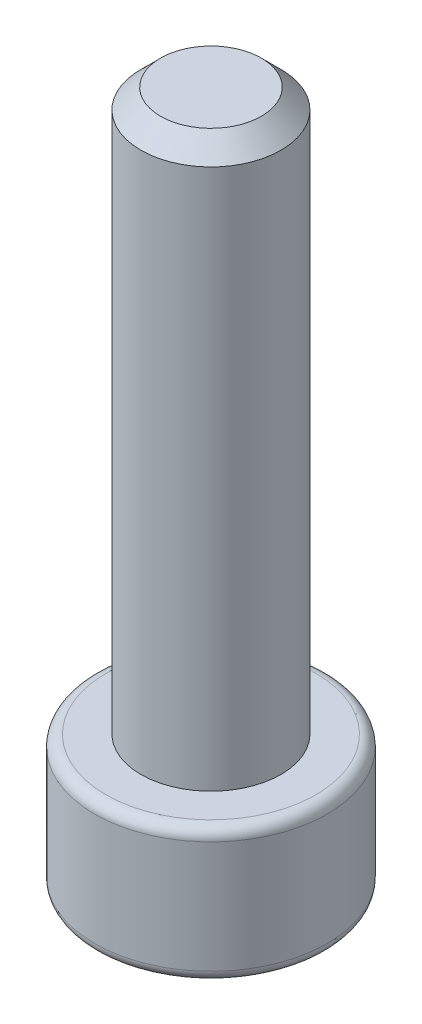
ISO-10303-21;
HEADER;
FILE_DESCRIPTION(('STEP AP214'),'2;1');
FILE_NAME('part.step','',(''),(''),'','','');
FILE_SCHEMA(('AUTOMOTIVE_DESIGN { 1 0 10303 214 1 1 1 1 }'));
ENDSEC;
DATA;
#1=APPLICATION_CONTEXT('core data for automotive mechanical design processes');
#2=APPLICATION_PROTOCOL_DEFINITION('international standard','automotive_design',2000,#1);
#3=PRODUCT_CONTEXT('',#1,'mechanical');
#4=PRODUCT('Part','Part','',(#3));
#5=PRODUCT_RELATED_PRODUCT_CATEGORY('part','',(#4));
#6=PRODUCT_DEFINITION_FORMATION('','',#4);
#7=PRODUCT_DEFINITION_CONTEXT('part definition',#1,'design');
#8=PRODUCT_DEFINITION('design','',#6,#7);
#9=PRODUCT_DEFINITION_SHAPE('','',#8);
#10=(LENGTH_UNIT() NAMED_UNIT(*) SI_UNIT(.MILLI.,.METRE.));
#11=(NAMED_UNIT(*) PLANE_ANGLE_UNIT() SI_UNIT($,.RADIAN.));
#12=(NAMED_UNIT(*) SI_UNIT($,.STERADIAN.) SOLID_ANGLE_UNIT());
#13=UNCERTAINTY_MEASURE_WITH_UNIT(LENGTH_MEASURE(1.E-05),#10,'distance_accuracy_value','');
#14=(GEOMETRIC_REPRESENTATION_CONTEXT(3) GLOBAL_UNCERTAINTY_ASSIGNED_CONTEXT((#13)) GLOBAL_UNIT_ASSIGNED_CONTEXT((#10,
#11,#12)) REPRESENTATION_CONTEXT('',''));
#15=CARTESIAN_POINT('',(0.,0.,0.));
#16=DIRECTION('',(0.,0.,1.));
#17=DIRECTION('',(1.,0.,0.));
#18=AXIS2_PLACEMENT_3D('',#15,#16,#17);
#19=CARTESIAN_POINT('',(0.,0.,0.));
#20=DIRECTION('',(0.,1.,0.));
#21=DIRECTION('',(0.,0.,1.));
#22=AXIS2_PLACEMENT_3D('',#19,#20,#21);
#23=PLANE('',#22);
#24=CARTESIAN_POINT('',(0.,0.,0.));
#25=DIRECTION('',(0.,1.,0.));
#26=DIRECTION('',(0.,0.,1.));
#27=AXIS2_PLACEMENT_3D('',#24,#25,#26);
#28=CIRCLE('',#27,3.75);
#29=CARTESIAN_POINT('',(0.,0.,3.75));
#30=VERTEX_POINT('',#29);
#31=EDGE_CURVE('E56',#30,#30,#28,.F.);
#32=ORIENTED_EDGE('',*,*,#31,.T.);
#33=EDGE_LOOP('',(#32));
#34=FACE_BOUND('',#33,.T.);
#35=DIRECTION('',(0.5,0.,0.866025403784439));
#36=VECTOR('',#35,1.);
#37=CARTESIAN_POINT('',(2.1650635094611,0.,-1.25));
#38=LINE('',#37,#36);
#39=CARTESIAN_POINT('',(1.44337567297406,0.,-2.5));
#40=VERTEX_POINT('',#39);
#41=CARTESIAN_POINT('',(2.88675134594813,0.,0.));
#42=VERTEX_POINT('',#41);
#43=EDGE_CURVE('E71',#40,#42,#38,.T.);
#44=ORIENTED_EDGE('',*,*,#43,.F.);
#45=DIRECTION('',(1.,0.,0.));
#46=VECTOR('',#45,1.);
#47=CARTESIAN_POINT('',(0.,0.,-2.5));
#48=LINE('',#47,#46);
#49=CARTESIAN_POINT('',(-1.44337567297406,0.,-2.5));
#50=VERTEX_POINT('',#49);
#51=EDGE_CURVE('E155',#50,#40,#48,.T.);
#52=ORIENTED_EDGE('',*,*,#51,.F.);
#53=DIRECTION('',(0.5,0.,-0.866025403784438));
#54=VECTOR('',#53,1.);
#55=CARTESIAN_POINT('',(-2.1650635094611,0.,-1.25));
#56=LINE('',#55,#54);
#57=CARTESIAN_POINT('',(-2.88675134594813,0.,0.));
#58=VERTEX_POINT('',#57);
#59=EDGE_CURVE('E158',#58,#50,#56,.T.);
#60=ORIENTED_EDGE('',*,*,#59,.F.);
#61=DIRECTION('',(-0.5,0.,-0.866025403784439));
#62=VECTOR('',#61,1.);
#63=CARTESIAN_POINT('',(-2.1650635094611,0.,1.25));
#64=LINE('',#63,#62);
#65=CARTESIAN_POINT('',(-1.44337567297406,0.,2.5));
#66=VERTEX_POINT('',#65);
#67=EDGE_CURVE('E161',#66,#58,#64,.T.);
#68=ORIENTED_EDGE('',*,*,#67,.F.);
#69=DIRECTION('',(-1.,0.,0.));
#70=VECTOR('',#69,1.);
#71=CARTESIAN_POINT('',(0.,0.,2.5));
#72=LINE('',#71,#70);
#73=CARTESIAN_POINT('',(1.44337567297406,0.,2.5));
#74=VERTEX_POINT('',#73);
#75=EDGE_CURVE('E164',#74,#66,#72,.T.);
#76=ORIENTED_EDGE('',*,*,#75,.F.);
#77=DIRECTION('',(-0.5,0.,0.866025403784438));
#78=VECTOR('',#77,1.);
#79=CARTESIAN_POINT('',(2.1650635094611,0.,1.25));
#80=LINE('',#79,#78);
#81=EDGE_CURVE('E167',#42,#74,#80,.T.);
#82=ORIENTED_EDGE('',*,*,#81,.F.);
#83=EDGE_LOOP('',(#44,#52,#60,#68,#76,#82));
#84=FACE_BOUND('',#83,.T.);
#85=ADVANCED_FACE('F47',(#34,#84),#23,.F.);
#86=CARTESIAN_POINT('',(0.,4.8,0.));
#87=DIRECTION('',(0.,-1.,0.));
#88=DIRECTION('',(0.,0.,-1.));
#89=AXIS2_PLACEMENT_3D('',#86,#87,#88);
#90=CYLINDRICAL_SURFACE('',#89,4.15);
#91=CARTESIAN_POINT('',(0.,0.4,0.));
#92=DIRECTION('',(0.,1.,0.));
#93=DIRECTION('',(0.,0.,1.));
#94=AXIS2_PLACEMENT_3D('',#91,#92,#93);
#95=CIRCLE('',#94,4.15);
#96=CARTESIAN_POINT('',(0.,0.4,4.15));
#97=VERTEX_POINT('',#96);
#98=EDGE_CURVE('E184',#97,#97,#95,.T.);
#99=ORIENTED_EDGE('',*,*,#98,.T.);
#100=EDGE_LOOP('',(#99));
#101=FACE_BOUND('',#100,.T.);
#102=CARTESIAN_POINT('',(0.,4.4,0.));
#103=DIRECTION('',(0.,1.,0.));
#104=DIRECTION('',(0.,0.,1.));
#105=AXIS2_PLACEMENT_3D('',#102,#103,#104);
#106=CIRCLE('',#105,4.15);
#107=CARTESIAN_POINT('',(0.,4.4,4.15));
#108=VERTEX_POINT('',#107);
#109=EDGE_CURVE('E180',#108,#108,#106,.F.);
#110=ORIENTED_EDGE('',*,*,#109,.T.);
#111=EDGE_LOOP('',(#110));
#112=FACE_BOUND('',#111,.T.);
#113=ADVANCED_FACE('F199',(#101,#112),#90,.T.);
#114=CARTESIAN_POINT('',(0.,4.8,0.));
#115=DIRECTION('',(0.,1.,0.));
#116=DIRECTION('',(0.,0.,1.));
#117=AXIS2_PLACEMENT_3D('',#114,#115,#116);
#118=PLANE('',#117);
#119=CARTESIAN_POINT('',(0.,4.8,0.));
#120=DIRECTION('',(0.,1.,0.));
#121=DIRECTION('',(0.,0.,1.));
#122=AXIS2_PLACEMENT_3D('',#119,#120,#121);
#123=CIRCLE('',#122,3.75);
#124=CARTESIAN_POINT('',(0.,4.8,3.75));
#125=VERTEX_POINT('',#124);
#126=EDGE_CURVE('E11',#125,#125,#123,.T.);
#127=ORIENTED_EDGE('',*,*,#126,.T.);
#128=EDGE_LOOP('',(#127));
#129=FACE_BOUND('',#128,.T.);
#130=CARTESIAN_POINT('',(0.,4.8,0.));
#131=DIRECTION('',(0.,1.,0.));
#132=DIRECTION('',(0.,0.,1.));
#133=AXIS2_PLACEMENT_3D('',#130,#131,#132);
#134=CIRCLE('',#133,2.5);
#135=CARTESIAN_POINT('',(0.,4.8,2.5));
#136=VERTEX_POINT('',#135);
#137=EDGE_CURVE('E109',#136,#136,#134,.T.);
#138=ORIENTED_EDGE('',*,*,#137,.F.);
#139=EDGE_LOOP('',(#138));
#140=FACE_BOUND('',#139,.T.);
#141=ADVANCED_FACE('F202',(#129,#140),#118,.T.);
#142=CARTESIAN_POINT('',(0.,24.8,0.));
#143=DIRECTION('',(0.,-1.,0.));
#144=DIRECTION('',(0.,0.,-1.));
#145=AXIS2_PLACEMENT_3D('',#142,#143,#144);
#146=CYLINDRICAL_SURFACE('',#145,2.5);
#147=CARTESIAN_POINT('',(0.,24.1,0.));
#148=DIRECTION('',(0.,1.,0.));
#149=DIRECTION('',(0.,0.,1.));
#150=AXIS2_PLACEMENT_3D('',#147,#148,#149);
#151=CIRCLE('',#150,2.5);
#152=CARTESIAN_POINT('',(0.,24.1,2.5));
#153=VERTEX_POINT('',#152);
#154=EDGE_CURVE('E176',#153,#153,#151,.F.);
#155=ORIENTED_EDGE('',*,*,#154,.T.);
#156=EDGE_LOOP('',(#155));
#157=FACE_BOUND('',#156,.T.);
#158=ORIENTED_EDGE('',*,*,#137,.T.);
#159=EDGE_LOOP('',(#158));
#160=FACE_BOUND('',#159,.T.);
#161=ADVANCED_FACE('F212',(#157,#160),#146,.T.);
#162=CARTESIAN_POINT('',(0.,24.8,0.));
#163=DIRECTION('',(0.,1.,0.));
#164=DIRECTION('',(0.,0.,1.));
#165=AXIS2_PLACEMENT_3D('',#162,#163,#164);
#166=PLANE('',#165);
#167=CARTESIAN_POINT('',(0.,24.8,0.));
#168=DIRECTION('',(0.,1.,0.));
#169=DIRECTION('',(0.,0.,1.));
#170=AXIS2_PLACEMENT_3D('',#167,#168,#169);
#171=CIRCLE('',#170,1.80000000000001);
#172=CARTESIAN_POINT('',(0.,24.8,1.80000000000001));
#173=VERTEX_POINT('',#172);
#174=EDGE_CURVE('E172',#173,#173,#171,.T.);
#175=ORIENTED_EDGE('',*,*,#174,.T.);
#176=EDGE_LOOP('',(#175));
#177=FACE_BOUND('',#176,.T.);
#178=ADVANCED_FACE('F217',(#177),#166,.T.);
#179=CARTESIAN_POINT('',(1.44337567297406,-1.2E-05,-2.5));
#180=DIRECTION('',(-0.866025403784439,0.,0.5));
#181=DIRECTION('',(0.5,0.,0.866025403784439));
#182=AXIS2_PLACEMENT_3D('',#179,#180,#181);
#183=PLANE('',#182);
#184=ORIENTED_EDGE('',*,*,#43,.T.);
#185=DIRECTION('',(0.,1.,0.));
#186=VECTOR('',#185,1.);
#187=CARTESIAN_POINT('',(2.88675134594813,-1.2E-05,0.));
#188=LINE('',#187,#186);
#189=CARTESIAN_POINT('',(2.88675134594813,2.5,0.));
#190=VERTEX_POINT('',#189);
#191=EDGE_CURVE('E100',#42,#190,#188,.T.);
#192=ORIENTED_EDGE('',*,*,#191,.T.);
#193=DIRECTION('',(0.5,0.,0.866025403784439));
#194=VECTOR('',#193,1.);
#195=CARTESIAN_POINT('',(1.44337567297406,2.5,-2.5));
#196=LINE('',#195,#194);
#197=CARTESIAN_POINT('',(1.44337567297406,2.5,-2.5));
#198=VERTEX_POINT('',#197);
#199=EDGE_CURVE('E104',#198,#190,#196,.T.);
#200=ORIENTED_EDGE('',*,*,#199,.F.);
#201=DIRECTION('',(0.,1.,0.));
#202=VECTOR('',#201,1.);
#203=CARTESIAN_POINT('',(1.44337567297406,-1.2E-05,-2.5));
#204=LINE('',#203,#202);
#205=EDGE_CURVE('E139',#40,#198,#204,.T.);
#206=ORIENTED_EDGE('',*,*,#205,.F.);
#207=EDGE_LOOP('',(#184,#192,#200,#206));
#208=FACE_BOUND('',#207,.T.);
#209=ADVANCED_FACE('F102',(#208),#183,.T.);
#210=CARTESIAN_POINT('',(2.88675134594813,-1.2E-05,0.));
#211=DIRECTION('',(-0.866025403784438,0.,-0.5));
#212=DIRECTION('',(-0.5,0.,0.866025403784438));
#213=AXIS2_PLACEMENT_3D('',#210,#211,#212);
#214=PLANE('',#213);
#215=ORIENTED_EDGE('',*,*,#81,.T.);
#216=DIRECTION('',(0.,1.,0.));
#217=VECTOR('',#216,1.);
#218=CARTESIAN_POINT('',(1.44337567297406,-1.2E-05,2.5));
#219=LINE('',#218,#217);
#220=CARTESIAN_POINT('',(1.44337567297406,2.5,2.5));
#221=VERTEX_POINT('',#220);
#222=EDGE_CURVE('E110',#74,#221,#219,.T.);
#223=ORIENTED_EDGE('',*,*,#222,.T.);
#224=DIRECTION('',(-0.5,0.,0.866025403784438));
#225=VECTOR('',#224,1.);
#226=CARTESIAN_POINT('',(2.88675134594813,2.5,0.));
#227=LINE('',#226,#225);
#228=EDGE_CURVE('E113',#190,#221,#227,.T.);
#229=ORIENTED_EDGE('',*,*,#228,.F.);
#230=ORIENTED_EDGE('',*,*,#191,.F.);
#231=EDGE_LOOP('',(#215,#223,#229,#230));
#232=FACE_BOUND('',#231,.T.);
#233=ADVANCED_FACE('F114',(#232),#214,.T.);
#234=CARTESIAN_POINT('',(1.44337567297406,-1.2E-05,2.5));
#235=DIRECTION('',(0.,0.,-1.));
#236=DIRECTION('',(-1.,0.,0.));
#237=AXIS2_PLACEMENT_3D('',#234,#235,#236);
#238=PLANE('',#237);
#239=ORIENTED_EDGE('',*,*,#75,.T.);
#240=DIRECTION('',(0.,1.,0.));
#241=VECTOR('',#240,1.);
#242=CARTESIAN_POINT('',(-1.44337567297406,-1.2E-05,2.5));
#243=LINE('',#242,#241);
#244=CARTESIAN_POINT('',(-1.44337567297406,2.5,2.5));
#245=VERTEX_POINT('',#244);
#246=EDGE_CURVE('E147',#66,#245,#243,.T.);
#247=ORIENTED_EDGE('',*,*,#246,.T.);
#248=DIRECTION('',(-1.,0.,0.));
#249=VECTOR('',#248,1.);
#250=CARTESIAN_POINT('',(1.44337567297406,2.5,2.5));
#251=LINE('',#250,#249);
#252=EDGE_CURVE('E120',#221,#245,#251,.T.);
#253=ORIENTED_EDGE('',*,*,#252,.F.);
#254=ORIENTED_EDGE('',*,*,#222,.F.);
#255=EDGE_LOOP('',(#239,#247,#253,#254));
#256=FACE_BOUND('',#255,.T.);
#257=ADVANCED_FACE('F255',(#256),#238,.T.);
#258=CARTESIAN_POINT('',(-1.44337567297406,-1.2E-05,2.5));
#259=DIRECTION('',(0.866025403784439,0.,-0.5));
#260=DIRECTION('',(-0.5,0.,-0.866025403784439));
#261=AXIS2_PLACEMENT_3D('',#258,#259,#260);
#262=PLANE('',#261);
#263=ORIENTED_EDGE('',*,*,#67,.T.);
#264=DIRECTION('',(0.,1.,0.));
#265=VECTOR('',#264,1.);
#266=CARTESIAN_POINT('',(-2.88675134594813,-1.2E-05,0.));
#267=LINE('',#266,#265);
#268=CARTESIAN_POINT('',(-2.88675134594813,2.5,0.));
#269=VERTEX_POINT('',#268);
#270=EDGE_CURVE('E144',#58,#269,#267,.T.);
#271=ORIENTED_EDGE('',*,*,#270,.T.);
#272=DIRECTION('',(-0.5,0.,-0.866025403784439));
#273=VECTOR('',#272,1.);
#274=CARTESIAN_POINT('',(-1.44337567297406,2.5,2.5));
#275=LINE('',#274,#273);
#276=EDGE_CURVE('E130',#245,#269,#275,.T.);
#277=ORIENTED_EDGE('',*,*,#276,.F.);
#278=ORIENTED_EDGE('',*,*,#246,.F.);
#279=EDGE_LOOP('',(#263,#271,#277,#278));
#280=FACE_BOUND('',#279,.T.);
#281=ADVANCED_FACE('F251',(#280),#262,.T.);
#282=CARTESIAN_POINT('',(-2.88675134594813,-1.2E-05,0.));
#283=DIRECTION('',(0.866025403784438,0.,0.5));
#284=DIRECTION('',(0.5,0.,-0.866025403784438));
#285=AXIS2_PLACEMENT_3D('',#282,#283,#284);
#286=PLANE('',#285);
#287=ORIENTED_EDGE('',*,*,#59,.T.);
#288=DIRECTION('',(0.,1.,0.));
#289=VECTOR('',#288,1.);
#290=CARTESIAN_POINT('',(-1.44337567297406,-1.2E-05,-2.5));
#291=LINE('',#290,#289);
#292=CARTESIAN_POINT('',(-1.44337567297406,2.5,-2.5));
#293=VERTEX_POINT('',#292);
#294=EDGE_CURVE('E63',#50,#293,#291,.T.);
#295=ORIENTED_EDGE('',*,*,#294,.T.);
#296=DIRECTION('',(0.5,0.,-0.866025403784438));
#297=VECTOR('',#296,1.);
#298=CARTESIAN_POINT('',(-2.88675134594813,2.5,0.));
#299=LINE('',#298,#297);
#300=EDGE_CURVE('E134',#269,#293,#299,.T.);
#301=ORIENTED_EDGE('',*,*,#300,.F.);
#302=ORIENTED_EDGE('',*,*,#270,.F.);
#303=EDGE_LOOP('',(#287,#295,#301,#302));
#304=FACE_BOUND('',#303,.T.);
#305=ADVANCED_FACE('F246',(#304),#286,.T.);
#306=CARTESIAN_POINT('',(-1.44337567297406,-1.2E-05,-2.5));
#307=DIRECTION('',(0.,0.,1.));
#308=DIRECTION('',(1.,0.,0.));
#309=AXIS2_PLACEMENT_3D('',#306,#307,#308);
#310=PLANE('',#309);
#311=ORIENTED_EDGE('',*,*,#51,.T.);
#312=ORIENTED_EDGE('',*,*,#205,.T.);
#313=DIRECTION('',(1.,0.,0.));
#314=VECTOR('',#313,1.);
#315=CARTESIAN_POINT('',(-1.44337567297406,2.5,-2.5));
#316=LINE('',#315,#314);
#317=EDGE_CURVE('E124',#293,#198,#316,.T.);
#318=ORIENTED_EDGE('',*,*,#317,.F.);
#319=ORIENTED_EDGE('',*,*,#294,.F.);
#320=EDGE_LOOP('',(#311,#312,#318,#319));
#321=FACE_BOUND('',#320,.T.);
#322=ADVANCED_FACE('F238',(#321),#310,.T.);
#323=CARTESIAN_POINT('',(0.,2.5,0.));
#324=DIRECTION('',(0.,-1.,0.));
#325=DIRECTION('',(0.,0.,-1.));
#326=AXIS2_PLACEMENT_3D('',#323,#324,#325);
#327=PLANE('',#326);
#328=ORIENTED_EDGE('',*,*,#199,.T.);
#329=ORIENTED_EDGE('',*,*,#228,.T.);
#330=ORIENTED_EDGE('',*,*,#252,.T.);
#331=ORIENTED_EDGE('',*,*,#276,.T.);
#332=ORIENTED_EDGE('',*,*,#300,.T.);
#333=ORIENTED_EDGE('',*,*,#317,.T.);
#334=EDGE_LOOP('',(#328,#329,#330,#331,#332,#333));
#335=FACE_BOUND('',#334,.T.);
#336=ADVANCED_FACE('F122',(#335),#327,.T.);
#337=CARTESIAN_POINT('',(0.,24.8,0.));
#338=DIRECTION('',(0.,-1.,0.));
#339=DIRECTION('',(0.,0.,-1.));
#340=AXIS2_PLACEMENT_3D('',#337,#338,#339);
#341=CONICAL_SURFACE('',#340,1.80000000000001,0.785398163397447);
#342=ORIENTED_EDGE('',*,*,#154,.F.);
#343=EDGE_LOOP('',(#342));
#344=FACE_BOUND('',#343,.T.);
#345=ORIENTED_EDGE('',*,*,#174,.F.);
#346=EDGE_LOOP('',(#345));
#347=FACE_BOUND('',#346,.T.);
#348=ADVANCED_FACE('F196',(#344,#347),#341,.T.);
#349=CARTESIAN_POINT('',(0.,0.4,0.));
#350=DIRECTION('',(0.,1.,0.));
#351=DIRECTION('',(0.,0.,1.));
#352=AXIS2_PLACEMENT_3D('',#349,#350,#351);
#353=TOROIDAL_SURFACE('',#352,3.75,0.4);
#354=ORIENTED_EDGE('',*,*,#31,.F.);
#355=EDGE_LOOP('',(#354));
#356=FACE_BOUND('',#355,.T.);
#357=ORIENTED_EDGE('',*,*,#98,.F.);
#358=EDGE_LOOP('',(#357));
#359=FACE_BOUND('',#358,.T.);
#360=ADVANCED_FACE('F193',(#356,#359),#353,.T.);
#361=CARTESIAN_POINT('',(0.,4.4,0.));
#362=DIRECTION('',(0.,1.,0.));
#363=DIRECTION('',(0.,0.,1.));
#364=AXIS2_PLACEMENT_3D('',#361,#362,#363);
#365=TOROIDAL_SURFACE('',#364,3.75,0.4);
#366=ORIENTED_EDGE('',*,*,#109,.F.);
#367=EDGE_LOOP('',(#366));
#368=FACE_BOUND('',#367,.T.);
#369=ORIENTED_EDGE('',*,*,#126,.F.);
#370=EDGE_LOOP('',(#369));
#371=FACE_BOUND('',#370,.T.);
#372=ADVANCED_FACE('F49',(#368,#371),#365,.T.);
#373=CLOSED_SHELL('',(#85,#113,#141,#161,#178,#209,#233,#257,#281,#305,#322,#336,#348,#360,#372));
#374=MANIFOLD_SOLID_BREP('B2',#373);
#375=ADVANCED_BREP_SHAPE_REPRESENTATION('',(#18,#374),#14);
#376=SHAPE_DEFINITION_REPRESENTATION(#9,#375);
ENDSEC;
END-ISO-10303-21;
